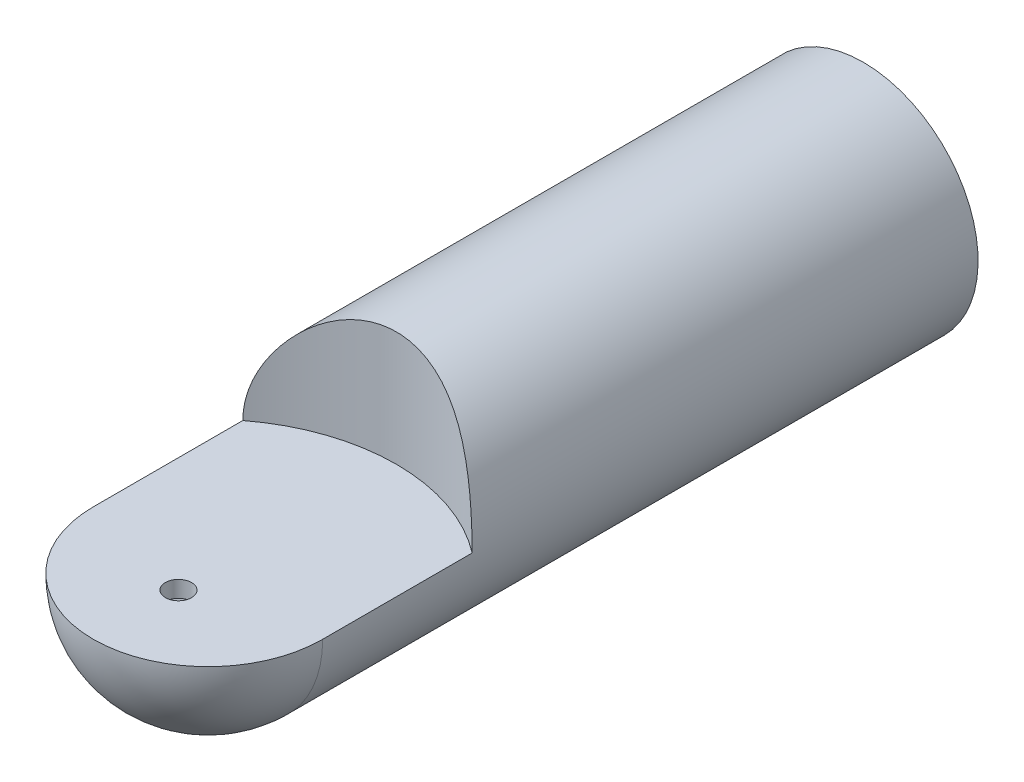
ISO-10303-21;
HEADER;
FILE_DESCRIPTION(('STEP AP214'),'2;1');
FILE_NAME('part.step','',(''),(''),'','','');
FILE_SCHEMA(('AUTOMOTIVE_DESIGN { 1 0 10303 214 1 1 1 1 }'));
ENDSEC;
DATA;
#1=APPLICATION_CONTEXT('core data for automotive mechanical design processes');
#2=APPLICATION_PROTOCOL_DEFINITION('international standard','automotive_design',2000,#1);
#3=PRODUCT_CONTEXT('',#1,'mechanical');
#4=PRODUCT('Part','Part','',(#3));
#5=PRODUCT_RELATED_PRODUCT_CATEGORY('part','',(#4));
#6=PRODUCT_DEFINITION_FORMATION('','',#4);
#7=PRODUCT_DEFINITION_CONTEXT('part definition',#1,'design');
#8=PRODUCT_DEFINITION('design','',#6,#7);
#9=PRODUCT_DEFINITION_SHAPE('','',#8);
#10=(LENGTH_UNIT() NAMED_UNIT(*) SI_UNIT(.MILLI.,.METRE.));
#11=(NAMED_UNIT(*) PLANE_ANGLE_UNIT() SI_UNIT($,.RADIAN.));
#12=(NAMED_UNIT(*) SI_UNIT($,.STERADIAN.) SOLID_ANGLE_UNIT());
#13=UNCERTAINTY_MEASURE_WITH_UNIT(LENGTH_MEASURE(1.E-05),#10,'distance_accuracy_value','');
#14=(GEOMETRIC_REPRESENTATION_CONTEXT(3) GLOBAL_UNCERTAINTY_ASSIGNED_CONTEXT((#13)) GLOBAL_UNIT_ASSIGNED_CONTEXT((#10,
#11,#12)) REPRESENTATION_CONTEXT('',''));
#15=CARTESIAN_POINT('',(0.,0.,0.));
#16=DIRECTION('',(0.,0.,1.));
#17=DIRECTION('',(1.,0.,0.));
#18=AXIS2_PLACEMENT_3D('',#15,#16,#17);
#19=CARTESIAN_POINT('',(0.,6.98296267768627E-13,-200.));
#20=DIRECTION('',(0.,0.,1.));
#21=DIRECTION('',(0.,-1.,0.));
#22=AXIS2_PLACEMENT_3D('',#19,#20,#21);
#23=CYLINDRICAL_SURFACE('',#22,30.);
#24=CARTESIAN_POINT('',(0.,6.98296267768627E-13,-200.));
#25=DIRECTION('',(0.,0.,-1.));
#26=DIRECTION('',(0.,1.,0.));
#27=AXIS2_PLACEMENT_3D('',#24,#25,#26);
#28=CIRCLE('',#27,30.);
#29=CARTESIAN_POINT('',(0.,30.0000000000007,-200.));
#30=VERTEX_POINT('',#29);
#31=EDGE_CURVE('E127',#30,#30,#28,.T.);
#32=ORIENTED_EDGE('',*,*,#31,.T.);
#33=EDGE_LOOP('',(#32));
#34=FACE_BOUND('',#33,.T.);
#35=DIRECTION('',(0.,0.,1.));
#36=VECTOR('',#35,1.);
#37=CARTESIAN_POINT('',(30.,0.,-60.));
#38=LINE('',#37,#36);
#39=CARTESIAN_POINT('',(30.,0.,-60.));
#40=VERTEX_POINT('',#39);
#41=CARTESIAN_POINT('',(30.,0.,-51.9615242270663));
#42=VERTEX_POINT('',#41);
#43=EDGE_CURVE('E115',#40,#42,#38,.T.);
#44=ORIENTED_EDGE('',*,*,#43,.T.);
#45=CARTESIAN_POINT('',(-30.,1.81422692176647E-13,-51.9615242270663));
#46=CARTESIAN_POINT('',(-30.0000091798726,0.392809760654041,-51.9615093263235));
#47=CARTESIAN_POINT('',(-29.9922851874291,0.785612678203957,-51.9659781302787));
#48=CARTESIAN_POINT('',(-29.961440464049,1.57039676987166,-51.9837730985279));
#49=CARTESIAN_POINT('',(-29.9383203732621,1.96237797747535,-51.9970988945596));
#50=CARTESIAN_POINT('',(-29.8767715969323,2.74450768419843,-52.0324871503205));
#51=CARTESIAN_POINT('',(-29.8383521437951,3.13465714528491,-52.0545443410389));
#52=CARTESIAN_POINT('',(-29.7463501290099,3.91255897612959,-52.1071724990167));
#53=CARTESIAN_POINT('',(-29.69276748444,4.30031133276705,-52.1377435128351));
#54=CARTESIAN_POINT('',(-29.510222440085,5.45442425006918,-52.2414267834424));
#55=CARTESIAN_POINT('',(-29.3590902808451,6.2163340881356,-52.3267274546173));
#56=CARTESIAN_POINT('',(-28.9993828663403,7.72241090624753,-52.526925852637));
#57=CARTESIAN_POINT('',(-28.7908010129577,8.46657583761071,-52.6418269790064));
#58=CARTESIAN_POINT('',(-28.3189990470382,9.93099846350205,-52.8971266720336));
#59=CARTESIAN_POINT('',(-28.0558998680208,10.6513050481136,-53.0374687193425));
#60=CARTESIAN_POINT('',(-27.4772646843731,12.0658170142195,-53.3395383584033));
#61=CARTESIAN_POINT('',(-27.1617293514576,12.76002272993,-53.5012656762014));
#62=CARTESIAN_POINT('',(-26.4802145075927,14.120116040062,-53.8418377777769));
#63=CARTESIAN_POINT('',(-26.1141626015585,14.7859611660341,-54.0207070130884));
#64=CARTESIAN_POINT('',(-25.3343739367879,16.0855157677059,-54.3907688004122));
#65=CARTESIAN_POINT('',(-24.9206347795692,16.7192236247164,-54.581961972057));
#66=CARTESIAN_POINT('',(-24.0120389363782,18.0024879905419,-54.9880839402806));
#67=CARTESIAN_POINT('',(-23.5133151137554,18.6490996411369,-55.2036749068246));
#68=CARTESIAN_POINT('',(-22.4655015730013,19.8989018127804,-55.6383226215725));
#69=CARTESIAN_POINT('',(-21.916409641113,20.5020904232371,-55.8573795217591));
#70=CARTESIAN_POINT('',(-20.7704149631897,21.662290340859,-56.2935678892847));
#71=CARTESIAN_POINT('',(-20.1735004962016,22.2192902590201,-56.510698870022));
#72=CARTESIAN_POINT('',(-18.9347368840772,23.2839598337948,-56.9377289243244));
#73=CARTESIAN_POINT('',(-18.2928864232626,23.7916280449881,-57.147627785872));
#74=CARTESIAN_POINT('',(-16.9223258347001,24.7870903985199,-57.5689403537398));
#75=CARTESIAN_POINT('',(-16.1906770936463,25.2712139357782,-57.779495091711));
#76=CARTESIAN_POINT('',(-14.6836489819937,26.1756128796046,-58.1807394258518));
#77=CARTESIAN_POINT('',(-13.9082670936699,26.5958846050576,-58.3714278765128));
#78=CARTESIAN_POINT('',(-12.3190710741689,27.3682398933905,-58.7273626077921));
#79=CARTESIAN_POINT('',(-11.5052755177489,27.7203560008774,-58.8926210235971));
#80=CARTESIAN_POINT('',(-9.84478503552948,28.3525868006262,-59.1928349582515));
#81=CARTESIAN_POINT('',(-8.99809361803839,28.6327091468132,-59.3277936981792));
#82=CARTESIAN_POINT('',(-7.33985505004734,29.1000844851375,-59.5548174094954));
#83=CARTESIAN_POINT('',(-6.53009343195671,29.2925269515887,-59.6492510184358));
#84=CARTESIAN_POINT('',(-4.89432640102882,29.6097873619636,-59.8056887350046));
#85=CARTESIAN_POINT('',(-4.06832169560414,29.7346082441864,-59.8676942516973));
#86=CARTESIAN_POINT('',(-2.40733657148733,29.9149169026983,-59.9574527357695));
#87=CARTESIAN_POINT('',(-1.5723607858635,29.970438881347,-59.9852226000158));
#88=CARTESIAN_POINT('',(0.0997187683066177,30.0114861086271,-60.0057409160246));
#89=CARTESIAN_POINT('',(0.936822403551029,29.9970156390292,-59.9984915100824));
#90=CARTESIAN_POINT('',(2.53310337771609,29.9026077267696,-59.9513515157758));
#91=CARTESIAN_POINT('',(3.2927186774459,29.8284810427445,-59.9143583761271));
#92=CARTESIAN_POINT('',(4.80219564850333,29.6229475529163,-59.8122984805113));
#93=CARTESIAN_POINT('',(5.55205800274208,29.4915447801227,-59.7472337011697));
#94=CARTESIAN_POINT('',(7.03697520684407,29.1728928538575,-59.5905903237625));
#95=CARTESIAN_POINT('',(7.77202985660625,28.9856429462462,-59.4990113676594));
#96=CARTESIAN_POINT('',(9.22270786194143,28.557201003996,-59.2914717944373));
#97=CARTESIAN_POINT('',(9.93833051974477,28.3160070351828,-59.1755103030869));
#98=CARTESIAN_POINT('',(11.3556880867226,27.778242935097,-58.9200648452848));
#99=CARTESIAN_POINT('',(12.0570963219388,27.4809563726333,-58.7802791144361));
#100=CARTESIAN_POINT('',(13.4319303548073,26.8357953626498,-58.4814346674831));
#101=CARTESIAN_POINT('',(14.1053561794792,26.4879209639788,-58.3223759699893));
#102=CARTESIAN_POINT('',(15.4212013768469,25.7440845394983,-57.9883389229998));
#103=CARTESIAN_POINT('',(16.0636121731183,25.3481093178501,-57.8133562082736));
#104=CARTESIAN_POINT('',(17.314449145332,24.5107416781157,-57.4511440623537));
#105=CARTESIAN_POINT('',(17.9228734715854,24.0693467918056,-57.2639139658069));
#106=CARTESIAN_POINT('',(19.159154312019,23.0997978631767,-56.8628866553975));
#107=CARTESIAN_POINT('',(19.7834157381774,22.5673869156107,-56.6482506804608));
#108=CARTESIAN_POINT('',(20.6847334249277,21.7326848689268,-56.3226775398882));
#109=CARTESIAN_POINT('',(20.9793465062815,21.448415202506,-56.2135421172428));
#110=CARTESIAN_POINT('',(21.5566666798484,20.8681014574253,-55.9946910130667));
#111=CARTESIAN_POINT('',(21.8393710101746,20.5720546780261,-55.8849752035011));
#112=CARTESIAN_POINT('',(22.6693827857693,19.6664681355554,-55.5558585245773));
#113=CARTESIAN_POINT('',(23.1982502905715,19.039795932454,-55.3366119945165));
#114=CARTESIAN_POINT('',(24.2038357107074,17.7439265916168,-54.9042254603086));
#115=CARTESIAN_POINT('',(24.6805540226717,17.0747297773715,-54.6910854097266));
#116=CARTESIAN_POINT('',(25.3687845167562,16.0192510677325,-54.3736529457869));
#117=CARTESIAN_POINT('',(25.6000614006936,15.6470194077533,-54.2650720787736));
#118=CARTESIAN_POINT('',(26.0465285101413,14.8919679784222,-54.0521922450326));
#119=CARTESIAN_POINT('',(26.2617223185046,14.5091505934591,-53.9478923269789));
#120=CARTESIAN_POINT('',(26.8826474204278,13.3452744903072,-53.6426706567808));
#121=CARTESIAN_POINT('',(27.2637193525292,12.5487964778061,-53.4494284070767));
#122=CARTESIAN_POINT('',(27.9552155580417,10.9218070433223,-53.0910297637089));
#123=CARTESIAN_POINT('',(28.2657869268702,10.0913708291303,-52.9258150776784));
#124=CARTESIAN_POINT('',(28.8134500568311,8.40080876319936,-52.6296713041899));
#125=CARTESIAN_POINT('',(29.0505736564392,7.54069595601538,-52.4987273647188));
#126=CARTESIAN_POINT('',(29.3731430534851,6.12612467786132,-52.3186232181902));
#127=CARTESIAN_POINT('',(29.4820873551508,5.57845147740076,-52.2572301454009));
#128=CARTESIAN_POINT('',(29.6694120393373,4.47640403965738,-52.1511034272162));
#129=CARTESIAN_POINT('',(29.7478008878682,3.92203170245884,-52.1063651674206));
#130=CARTESIAN_POINT('',(29.8735953362339,2.80768692155723,-52.0343526778058));
#131=CARTESIAN_POINT('',(29.9209473822713,2.24770648209844,-52.0071086357803));
#132=CARTESIAN_POINT('',(29.9841756942571,1.12516021358658,-51.9706593181305));
#133=CARTESIAN_POINT('',(30.0000390911404,0.562593421623771,-51.9614614177839));
#134=CARTESIAN_POINT('',(30.,1.78766613958742E-13,-51.9615242270663));
#135=B_SPLINE_CURVE_WITH_KNOTS('',3,(#45,#46,#47,#48,#49,#50,#51,#52,#53,#54,#55,#56,#57,#58,
#59,#60,#61,#62,#63,#64,#65,#66,#67,#68,#69,#70,#71,#72,#73,#74,#75,#76,#77,#78,#79,#80,#81,#82,
#83,#84,#85,#86,#87,#88,#89,#90,#91,#92,#93,#94,#95,#96,#97,#98,#99,#100,#101,#102,#103,#104,
#105,#106,#107,#108,#109,#110,#111,#112,#113,#114,#115,#116,#117,#118,#119,#120,#121,#122,#123,
#124,#125,#126,#127,#128,#129,#130,#131,#132,#133,#134),.UNSPECIFIED.,.F.,.F.,(4,2,2,2,2,2,2,2,
2,2,2,2,2,2,2,2,2,2,2,2,2,2,2,2,2,2,2,2,2,2,2,2,2,2,2,2,2,2,2,2,2,2,2,2,4),(0.,1.17831572874021,
2.35658246770658,3.53413925605337,4.71170248416026,7.05273917038327,9.39404483769565,
11.7302114407247,14.0663481194249,16.4058681607371,18.7455059221455,21.2765523321911,
23.807710039025,26.3394900231363,28.8713441661112,31.5745573990549,34.27792641562,
36.9800013597355,39.6817889172559,42.1913499257393,44.7008018798057,47.209014807613,
49.7170742980536,52.0067258400078,54.2962161856332,56.585737449117,58.8753408169734,
61.1964548717646,63.517566685249,65.8393167099478,68.1611929713416,70.7024391151354,
71.9732419426945,73.2443378911899,75.7879596068649,78.3315619751911,79.6856162064097,
81.0393678880376,83.7468883996948,86.4487068107121,89.1493523807025,90.8336693824939,
92.5175193776956,94.2042672491591,95.8917043341319),.UNSPECIFIED.);
#136=CARTESIAN_POINT('',(-30.,0.,-51.9615242270663));
#137=VERTEX_POINT('',#136);
#138=EDGE_CURVE('E59',#137,#42,#135,.T.);
#139=ORIENTED_EDGE('',*,*,#138,.F.);
#140=DIRECTION('',(0.,0.,1.));
#141=VECTOR('',#140,1.);
#142=CARTESIAN_POINT('',(-30.,0.,-60.));
#143=LINE('',#142,#141);
#144=CARTESIAN_POINT('',(-30.,0.,-60.));
#145=VERTEX_POINT('',#144);
#146=EDGE_CURVE('E107',#145,#137,#143,.T.);
#147=ORIENTED_EDGE('',*,*,#146,.F.);
#148=CARTESIAN_POINT('',(0.,2.09488880330588E-13,-60.));
#149=DIRECTION('',(0.,0.,-1.));
#150=DIRECTION('',(0.,1.,0.));
#151=AXIS2_PLACEMENT_3D('',#148,#149,#150);
#152=CIRCLE('',#151,30.);
#153=CARTESIAN_POINT('',(-29.5803989154981,-4.99999999999979,-60.));
#154=VERTEX_POINT('',#153);
#155=EDGE_CURVE('E50',#154,#145,#152,.T.);
#156=ORIENTED_EDGE('',*,*,#155,.F.);
#157=DIRECTION('',(0.,0.,1.));
#158=VECTOR('',#157,1.);
#159=CARTESIAN_POINT('',(-29.5803989154981,-4.9999999999993,-200.));
#160=LINE('',#159,#158);
#161=CARTESIAN_POINT('',(-29.5803989154981,-5.,0.));
#162=VERTEX_POINT('',#161);
#163=EDGE_CURVE('E69',#154,#162,#160,.T.);
#164=ORIENTED_EDGE('',*,*,#163,.T.);
#165=CARTESIAN_POINT('',(0.,0.,0.));
#166=DIRECTION('',(0.,0.,1.));
#167=DIRECTION('',(0.,-1.,0.));
#168=AXIS2_PLACEMENT_3D('',#165,#166,#167);
#169=CIRCLE('',#168,30.);
#170=CARTESIAN_POINT('',(29.5803989154981,-5.,0.));
#171=VERTEX_POINT('',#170);
#172=EDGE_CURVE('E139',#162,#171,#169,.T.);
#173=ORIENTED_EDGE('',*,*,#172,.T.);
#174=DIRECTION('',(0.,0.,1.));
#175=VECTOR('',#174,1.);
#176=CARTESIAN_POINT('',(29.5803989154981,-4.9999999999993,-200.));
#177=LINE('',#176,#175);
#178=CARTESIAN_POINT('',(29.5803989154981,-4.99999999999979,-60.));
#179=VERTEX_POINT('',#178);
#180=EDGE_CURVE('E117',#171,#179,#177,.F.);
#181=ORIENTED_EDGE('',*,*,#180,.T.);
#182=EDGE_CURVE('E11',#40,#179,#152,.T.);
#183=ORIENTED_EDGE('',*,*,#182,.F.);
#184=EDGE_LOOP('',(#44,#139,#147,#156,#164,#173,#181,#183));
#185=FACE_BOUND('',#184,.T.);
#186=ADVANCED_FACE('F43',(#34,#185),#23,.F.);
#187=CARTESIAN_POINT('',(0.,0.,0.));
#188=DIRECTION('',(0.,1.,0.));
#189=DIRECTION('',(0.,0.,1.));
#190=AXIS2_PLACEMENT_3D('',#187,#188,#189);
#191=PLANE('',#190);
#192=ORIENTED_EDGE('',*,*,#146,.T.);
#193=CARTESIAN_POINT('',(0.,0.,0.));
#194=DIRECTION('',(0.,1.,0.));
#195=DIRECTION('',(0.,0.,1.));
#196=AXIS2_PLACEMENT_3D('',#193,#194,#195);
#197=CIRCLE('',#196,60.);
#198=CARTESIAN_POINT('',(0.,0.,-60.));
#199=VERTEX_POINT('',#198);
#200=EDGE_CURVE('E97',#199,#137,#197,.T.);
#201=ORIENTED_EDGE('',*,*,#200,.F.);
#202=DIRECTION('',(1.,0.,0.));
#203=VECTOR('',#202,1.);
#204=CARTESIAN_POINT('',(30.,0.,-60.));
#205=LINE('',#204,#203);
#206=EDGE_CURVE('E120',#145,#199,#205,.T.);
#207=ORIENTED_EDGE('',*,*,#206,.F.);
#208=EDGE_LOOP('',(#192,#201,#207));
#209=FACE_BOUND('',#208,.T.);
#210=ADVANCED_FACE('F114',(#209),#191,.T.);
#211=EDGE_CURVE('E233',#199,#40,#205,.T.);
#212=ORIENTED_EDGE('',*,*,#211,.F.);
#213=EDGE_CURVE('E100',#42,#199,#197,.T.);
#214=ORIENTED_EDGE('',*,*,#213,.F.);
#215=ORIENTED_EDGE('',*,*,#43,.F.);
#216=EDGE_LOOP('',(#212,#214,#215));
#217=FACE_BOUND('',#216,.T.);
#218=ADVANCED_FACE('F176',(#217),#191,.T.);
#219=CARTESIAN_POINT('',(0.,6.98296267768627E-13,-200.));
#220=DIRECTION('',(0.,0.,1.));
#221=DIRECTION('',(0.,-1.,0.));
#222=AXIS2_PLACEMENT_3D('',#219,#220,#221);
#223=CYLINDRICAL_SURFACE('',#222,35.);
#224=CARTESIAN_POINT('',(0.,6.98296267768627E-13,-200.));
#225=DIRECTION('',(0.,0.,-1.));
#226=DIRECTION('',(0.,1.,0.));
#227=AXIS2_PLACEMENT_3D('',#224,#225,#226);
#228=CIRCLE('',#227,35.);
#229=CARTESIAN_POINT('',(0.,35.0000000000007,-200.));
#230=VERTEX_POINT('',#229);
#231=EDGE_CURVE('E126',#230,#230,#228,.T.);
#232=ORIENTED_EDGE('',*,*,#231,.F.);
#233=EDGE_LOOP('',(#232));
#234=FACE_BOUND('',#233,.T.);
#235=DIRECTION('',(0.,0.,-1.));
#236=VECTOR('',#235,1.);
#237=CARTESIAN_POINT('',(-35.,0.,0.));
#238=LINE('',#237,#236);
#239=CARTESIAN_POINT('',(-35.,0.,0.));
#240=VERTEX_POINT('',#239);
#241=CARTESIAN_POINT('',(-35.,0.,-45.6207189772366));
#242=VERTEX_POINT('',#241);
#243=EDGE_CURVE('E191',#240,#242,#238,.T.);
#244=ORIENTED_EDGE('',*,*,#243,.T.);
#245=CARTESIAN_POINT('',(35.,1.59283888973629E-13,-45.6207189772366));
#246=CARTESIAN_POINT('',(35.0000132814846,0.441016017965573,-45.6206936340977));
#247=CARTESIAN_POINT('',(34.9916647919843,0.882021446764125,-45.6271133292722));
#248=CARTESIAN_POINT('',(34.9583447843239,1.76300413175627,-45.6526552963177));
#249=CARTESIAN_POINT('',(34.9333744835933,2.20298146088264,-45.6717766378834));
#250=CARTESIAN_POINT('',(34.866944416921,3.08052887810543,-45.7225091876469));
#251=CARTESIAN_POINT('',(34.8255010886678,3.51810092636903,-45.7541079449904));
#252=CARTESIAN_POINT('',(34.7263280924881,4.39031595424183,-45.8294225480693));
#253=CARTESIAN_POINT('',(34.6685982300864,4.82495889881154,-45.8731385384947));
#254=CARTESIAN_POINT('',(34.4724127336728,6.11602996314459,-46.0209724012366));
#255=CARTESIAN_POINT('',(34.3103872772125,6.96708379793807,-46.1422231362879));
#256=CARTESIAN_POINT('',(33.9256692067137,8.64831231569428,-46.4258091177432));
#257=CARTESIAN_POINT('',(33.7029638091541,9.47848255878341,-46.5881530207854));
#258=CARTESIAN_POINT('',(33.2007979980055,11.1100255799001,-46.9473303976439));
#259=CARTESIAN_POINT('',(32.9215630197599,11.9114983094678,-47.1440264628765));
#260=CARTESIAN_POINT('',(32.3087563273008,13.4854589468316,-47.5660861861284));
#261=CARTESIAN_POINT('',(31.9751863803307,14.2579477963226,-47.7914489117132));
#262=CARTESIAN_POINT('',(31.2556860108866,15.7729825993509,-48.26508016035));
#263=CARTESIAN_POINT('',(30.8696427531386,16.5154594264205,-48.5133976653245));
#264=CARTESIAN_POINT('',(30.0481406672281,17.9667629954317,-49.0264591273308));
#265=CARTESIAN_POINT('',(29.6126761218755,18.675585830707,-49.2912049832304));
#266=CARTESIAN_POINT('',(28.8953359052901,19.7554435956038,-49.71317185343));
#267=CARTESIAN_POINT('',(28.6295402988808,20.1386812719649,-49.8668021422883));
#268=CARTESIAN_POINT('',(28.0833998636072,20.8935306856562,-50.1764006159407));
#269=CARTESIAN_POINT('',(27.8030580849819,21.2651448343791,-50.3323683057576));
#270=CARTESIAN_POINT('',(26.9405302253458,22.3623229223068,-50.8024254036508));
#271=CARTESIAN_POINT('',(26.3368315562118,23.0702376395365,-51.1186748208723));
#272=CARTESIAN_POINT('',(25.0744880639146,24.4363536407795,-51.7495720536684));
#273=CARTESIAN_POINT('',(24.4158257186558,25.0945389429509,-52.0642193243087));
#274=CARTESIAN_POINT('',(23.045885785789,26.3582155126085,-52.6849379089432));
#275=CARTESIAN_POINT('',(22.3346054311267,26.963704005247,-52.9910087707561));
#276=CARTESIAN_POINT('',(20.7787808356351,28.1837984124997,-53.6215791087673));
#277=CARTESIAN_POINT('',(19.9282521335271,28.7917404314311,-53.9442676201934));
#278=CARTESIAN_POINT('',(18.1688933319955,29.9331053100772,-54.5619879938027));
#279=CARTESIAN_POINT('',(17.2600577162505,30.4665211037724,-54.8570172326692));
#280=CARTESIAN_POINT('',(15.3897841935553,31.4526828959021,-55.4107832527335));
#281=CARTESIAN_POINT('',(14.428381299362,31.9054817544519,-55.669543791274));
#282=CARTESIAN_POINT('',(12.4590681886559,32.7247361022959,-56.1430899324929));
#283=CARTESIAN_POINT('',(11.4511659311932,33.0912063029221,-56.3578830268781));
#284=CARTESIAN_POINT('',(9.4974817984731,33.7007479278822,-56.7180405241708));
#285=CARTESIAN_POINT('',(8.55523765081944,33.9523720276384,-56.8681350267426));
#286=CARTESIAN_POINT('',(6.64707865589367,34.3769011936379,-57.122608364808));
#287=CARTESIAN_POINT('',(5.68116521419584,34.5498109223646,-57.2269899080006));
#288=CARTESIAN_POINT('',(3.73501516988287,34.8139804068221,-57.3868641741261));
#289=CARTESIAN_POINT('',(2.7547908583927,34.9053064704244,-57.4423965990646));
#290=CARTESIAN_POINT('',(0.788614451661071,35.0049522822935,-57.5030003461268));
#291=CARTESIAN_POINT('',(-0.197337024072321,35.0132808470662,-57.5080770279703));
#292=CARTESIAN_POINT('',(-2.0395789943252,34.9510807319127,-57.4702332065138));
#293=CARTESIAN_POINT('',(-2.89635168324428,34.8904846196985,-57.4333581306057));
#294=CARTESIAN_POINT('',(-4.60063638724798,34.7068944250947,-57.3220128544264));
#295=CARTESIAN_POINT('',(-5.44814937623926,34.5839069706453,-57.24754664753));
#296=CARTESIAN_POINT('',(-7.12809602364315,34.2770983352651,-57.062724333655));
#297=CARTESIAN_POINT('',(-7.96052915530841,34.0932750336112,-56.9523669755218));
#298=CARTESIAN_POINT('',(-9.60500648186516,33.6669784914873,-56.6982025689736));
#299=CARTESIAN_POINT('',(-10.4170498282986,33.4245028148291,-56.5543941311424));
#300=CARTESIAN_POINT('',(-12.0197919872125,32.882270182947,-56.2356237981317));
#301=CARTESIAN_POINT('',(-12.8103740253839,32.5822521816088,-56.0605201862074));
#302=CARTESIAN_POINT('',(-14.3622632121242,31.9285824553564,-55.6831498159794));
#303=CARTESIAN_POINT('',(-15.1235706620071,31.5749312826567,-55.4808833373507));
#304=CARTESIAN_POINT('',(-16.6137262375867,30.8169270445394,-55.0530208980489));
#305=CARTESIAN_POINT('',(-17.3425714484937,30.4125694385705,-54.8274228484477));
#306=CARTESIAN_POINT('',(-18.7651021471887,29.5560549205275,-54.3569895350225));
#307=CARTESIAN_POINT('',(-19.4587854177235,29.1038949996531,-54.1121530605319));
#308=CARTESIAN_POINT('',(-20.8906038993477,28.0969508910228,-53.5769103422869));
#309=CARTESIAN_POINT('',(-21.623946524254,27.536370075773,-53.284576478484));
#310=CARTESIAN_POINT('',(-23.041152628684,26.3619500991852,-52.6872542959178));
#311=CARTESIAN_POINT('',(-23.725012663748,25.7481072368292,-52.3822650985433));
#312=CARTESIAN_POINT('',(-25.0420573812055,24.4691495713648,-51.7655763599103));
#313=CARTESIAN_POINT('',(-25.675159524482,23.8039545771049,-51.453866894574));
#314=CARTESIAN_POINT('',(-26.8873114700552,22.4257614393082,-50.8309640578512));
#315=CARTESIAN_POINT('',(-27.4663585906595,21.7127609271314,-50.5197707128211));
#316=CARTESIAN_POINT('',(-28.6353077614154,20.1514910628975,-49.8675238967361));
#317=CARTESIAN_POINT('',(-29.2179210081707,19.297329600938,-49.5274573733706));
#318=CARTESIAN_POINT('',(-30.3084689084648,17.5348425247009,-48.8677097009765));
#319=CARTESIAN_POINT('',(-30.8163914637436,16.6265081690165,-48.5480318592074));
#320=CARTESIAN_POINT('',(-31.7513879228928,14.7625503489126,-47.9417239977363));
#321=CARTESIAN_POINT('',(-32.1787231778982,13.8070928866001,-47.6549883688326));
#322=CARTESIAN_POINT('',(-32.9492639381029,11.8511474057963,-47.1255227816072));
#323=CARTESIAN_POINT('',(-33.2924986067358,10.8506751398715,-46.8827775764176));
#324=CARTESIAN_POINT('',(-33.8203049594494,9.0473531106274,-46.5028684296739));
#325=CARTESIAN_POINT('',(-34.023212444939,8.25223104669917,-46.3542681521152));
#326=CARTESIAN_POINT('',(-34.3734884400708,6.64378548642291,-46.0951304821315));
#327=CARTESIAN_POINT('',(-34.5208760608657,5.83046835552966,-45.9845799932692));
#328=CARTESIAN_POINT('',(-34.6991799941177,4.59796140090872,-45.8499978262223));
#329=CARTESIAN_POINT('',(-34.7516014047319,4.18344222948181,-45.8102538660641));
#330=CARTESIAN_POINT('',(-34.8416393102244,3.35186445255087,-45.7418124503328));
#331=CARTESIAN_POINT('',(-34.8792559933204,2.93480587939961,-45.7131148543234));
#332=CARTESIAN_POINT('',(-34.9395461499552,2.0985694689288,-45.6670518527829));
#333=CARTESIAN_POINT('',(-34.9622046257737,1.67938992795854,-45.6496978209517));
#334=CARTESIAN_POINT('',(-34.9924374838216,0.840143232048944,-45.6265205897732));
#335=CARTESIAN_POINT('',(-35.0000109086939,0.420076022468118,-45.6206981222645));
#336=CARTESIAN_POINT('',(-35.,1.37312386020026E-13,-45.6207189772366));
#337=B_SPLINE_CURVE_WITH_KNOTS('',3,(#245,#246,#247,#248,#249,#250,#251,#252,#253,#254,#255,
#256,#257,#258,#259,#260,#261,#262,#263,#264,#265,#266,#267,#268,#269,#270,#271,#272,#273,#274,
#275,#276,#277,#278,#279,#280,#281,#282,#283,#284,#285,#286,#287,#288,#289,#290,#291,#292,#293,
#294,#295,#296,#297,#298,#299,#300,#301,#302,#303,#304,#305,#306,#307,#308,#309,#310,#311,#312,
#313,#314,#315,#316,#317,#318,#319,#320,#321,#322,#323,#324,#325,#326,#327,#328,#329,#330,#331,
#332,#333,#334,#335,#336),.UNSPECIFIED.,.F.,.F.,(4,2,2,2,2,2,2,2,2,2,2,2,2,2,2,2,2,2,2,2,2,2,2,
2,2,2,2,2,2,2,2,2,2,2,2,2,2,2,2,2,2,2,2,2,2,4),(0.,1.32290395042524,2.64571101820999,
3.96720141714135,5.28870759648408,7.90924951242997,10.5303439287377,13.1411845567359,
15.7519402841624,18.3684015475106,20.9851657993925,22.4579641738505,23.9304549503118,
26.8753792464394,29.8212459801485,32.7672677401669,36.0453279926054,39.3236988355996,
42.5999120866834,45.8755666312454,48.831526005823,51.7873102674592,54.7406899968898,
57.6937559967766,60.2697803608123,62.8455311266169,65.421371691937,67.9973192658826,
70.5852417706173,73.1731376315552,75.7612653935573,78.3495561560571,81.2513455944497,
84.1533368311037,87.0599552159643,89.9667177228426,93.2279841659401,96.4897782824408,
99.7408050327975,102.990702828935,105.489968857812,107.988373796759,109.247153689409,
110.505917578229,111.765941646903,113.026045679142),.UNSPECIFIED.);
#338=CARTESIAN_POINT('',(35.,0.,-45.6207189772366));
#339=VERTEX_POINT('',#338);
#340=EDGE_CURVE('E184',#339,#242,#337,.T.);
#341=ORIENTED_EDGE('',*,*,#340,.F.);
#342=DIRECTION('',(0.,0.,-1.));
#343=VECTOR('',#342,1.);
#344=CARTESIAN_POINT('',(35.,0.,0.));
#345=LINE('',#344,#343);
#346=CARTESIAN_POINT('',(35.,0.,0.));
#347=VERTEX_POINT('',#346);
#348=EDGE_CURVE('E113',#347,#339,#345,.T.);
#349=ORIENTED_EDGE('',*,*,#348,.F.);
#350=CARTESIAN_POINT('',(0.,0.,0.));
#351=DIRECTION('',(0.,0.,1.));
#352=DIRECTION('',(0.,-1.,0.));
#353=AXIS2_PLACEMENT_3D('',#350,#351,#352);
#354=CIRCLE('',#353,35.);
#355=EDGE_CURVE('E143',#240,#347,#354,.T.);
#356=ORIENTED_EDGE('',*,*,#355,.F.);
#357=EDGE_LOOP('',(#244,#341,#349,#356));
#358=FACE_BOUND('',#357,.T.);
#359=ADVANCED_FACE('F179',(#234,#358),#223,.T.);
#360=CARTESIAN_POINT('',(0.,0.,0.));
#361=DIRECTION('',(0.,1.,0.));
#362=DIRECTION('',(0.,0.,1.));
#363=AXIS2_PLACEMENT_3D('',#360,#361,#362);
#364=CIRCLE('',#363,57.5);
#365=EDGE_CURVE('E208',#339,#242,#364,.T.);
#366=ORIENTED_EDGE('',*,*,#365,.T.);
#367=ORIENTED_EDGE('',*,*,#243,.F.);
#368=CARTESIAN_POINT('',(0.,0.,0.));
#369=DIRECTION('',(0.,1.,0.));
#370=DIRECTION('',(0.,0.,1.));
#371=AXIS2_PLACEMENT_3D('',#368,#369,#370);
#372=CIRCLE('',#371,35.);
#373=EDGE_CURVE('E145',#240,#347,#372,.T.);
#374=ORIENTED_EDGE('',*,*,#373,.T.);
#375=ORIENTED_EDGE('',*,*,#348,.T.);
#376=EDGE_LOOP('',(#366,#367,#374,#375));
#377=FACE_BOUND('',#376,.T.);
#378=CARTESIAN_POINT('',(0.,0.,9.));
#379=DIRECTION('',(0.,1.,0.));
#380=DIRECTION('',(0.,0.,1.));
#381=AXIS2_PLACEMENT_3D('',#378,#379,#380);
#382=CIRCLE('',#381,4.);
#383=CARTESIAN_POINT('',(0.,0.,13.));
#384=VERTEX_POINT('',#383);
#385=EDGE_CURVE('E131',#384,#384,#382,.T.);
#386=ORIENTED_EDGE('',*,*,#385,.F.);
#387=EDGE_LOOP('',(#386));
#388=FACE_BOUND('',#387,.T.);
#389=ADVANCED_FACE('F180',(#377,#388),#191,.T.);
#390=CARTESIAN_POINT('',(0.,0.,0.));
#391=DIRECTION('',(-1.,0.,0.));
#392=DIRECTION('',(0.,1.,0.));
#393=AXIS2_PLACEMENT_3D('',#390,#391,#392);
#394=SPHERICAL_SURFACE('',#393,35.);
#395=ORIENTED_EDGE('',*,*,#355,.T.);
#396=ORIENTED_EDGE('',*,*,#373,.F.);
#397=EDGE_LOOP('',(#395,#396));
#398=FACE_BOUND('',#397,.T.);
#399=ADVANCED_FACE('F44',(#398),#394,.T.);
#400=CARTESIAN_POINT('',(0.,-5.,0.));
#401=DIRECTION('',(0.,1.,0.));
#402=DIRECTION('',(0.,0.,1.));
#403=AXIS2_PLACEMENT_3D('',#400,#401,#402);
#404=PLANE('',#403);
#405=CARTESIAN_POINT('',(0.,-5.,9.));
#406=DIRECTION('',(0.,1.,0.));
#407=DIRECTION('',(0.,0.,1.));
#408=AXIS2_PLACEMENT_3D('',#405,#406,#407);
#409=CIRCLE('',#408,4.);
#410=CARTESIAN_POINT('',(0.,-5.,13.));
#411=VERTEX_POINT('',#410);
#412=EDGE_CURVE('E132',#411,#411,#409,.T.);
#413=ORIENTED_EDGE('',*,*,#412,.T.);
#414=EDGE_LOOP('',(#413));
#415=FACE_BOUND('',#414,.T.);
#416=CARTESIAN_POINT('',(0.,-5.,0.));
#417=DIRECTION('',(0.,1.,0.));
#418=DIRECTION('',(0.,0.,1.));
#419=AXIS2_PLACEMENT_3D('',#416,#417,#418);
#420=CIRCLE('',#419,29.5803989154981);
#421=EDGE_CURVE('E137',#162,#171,#420,.T.);
#422=ORIENTED_EDGE('',*,*,#421,.F.);
#423=ORIENTED_EDGE('',*,*,#163,.F.);
#424=DIRECTION('',(-1.,0.,0.));
#425=VECTOR('',#424,1.);
#426=CARTESIAN_POINT('',(30.,-4.99999999999979,-60.));
#427=LINE('',#426,#425);
#428=EDGE_CURVE('E194',#179,#154,#427,.T.);
#429=ORIENTED_EDGE('',*,*,#428,.F.);
#430=ORIENTED_EDGE('',*,*,#180,.F.);
#431=EDGE_LOOP('',(#422,#423,#429,#430));
#432=FACE_BOUND('',#431,.T.);
#433=ADVANCED_FACE('F148',(#415,#432),#404,.F.);
#434=CARTESIAN_POINT('',(0.,0.,0.));
#435=DIRECTION('',(-1.,0.,0.));
#436=DIRECTION('',(0.,1.,0.));
#437=AXIS2_PLACEMENT_3D('',#434,#435,#436);
#438=SPHERICAL_SURFACE('',#437,30.);
#439=ORIENTED_EDGE('',*,*,#172,.F.);
#440=ORIENTED_EDGE('',*,*,#421,.T.);
#441=EDGE_LOOP('',(#439,#440));
#442=FACE_BOUND('',#441,.T.);
#443=ADVANCED_FACE('F152',(#442),#438,.F.);
#444=CARTESIAN_POINT('',(0.,-7.,9.));
#445=DIRECTION('',(0.,1.,0.));
#446=DIRECTION('',(0.,0.,1.));
#447=AXIS2_PLACEMENT_3D('',#444,#445,#446);
#448=CYLINDRICAL_SURFACE('',#447,4.);
#449=ORIENTED_EDGE('',*,*,#385,.T.);
#450=EDGE_LOOP('',(#449));
#451=FACE_BOUND('',#450,.T.);
#452=ORIENTED_EDGE('',*,*,#412,.F.);
#453=EDGE_LOOP('',(#452));
#454=FACE_BOUND('',#453,.T.);
#455=ADVANCED_FACE('F151',(#451,#454),#448,.F.);
#456=CARTESIAN_POINT('',(0.,6.98296267768627E-13,-200.));
#457=DIRECTION('',(0.,0.,-1.));
#458=DIRECTION('',(0.,1.,0.));
#459=AXIS2_PLACEMENT_3D('',#456,#457,#458);
#460=PLANE('',#459);
#461=ORIENTED_EDGE('',*,*,#231,.T.);
#462=EDGE_LOOP('',(#461));
#463=FACE_BOUND('',#462,.T.);
#464=ORIENTED_EDGE('',*,*,#31,.F.);
#465=EDGE_LOOP('',(#464));
#466=FACE_BOUND('',#465,.T.);
#467=ADVANCED_FACE('F153',(#463,#466),#460,.T.);
#468=CARTESIAN_POINT('',(0.,2.09488880330588E-13,-60.));
#469=DIRECTION('',(0.,0.,-1.));
#470=DIRECTION('',(0.,1.,0.));
#471=AXIS2_PLACEMENT_3D('',#468,#469,#470);
#472=PLANE('',#471);
#473=ORIENTED_EDGE('',*,*,#206,.T.);
#474=ORIENTED_EDGE('',*,*,#211,.T.);
#475=ORIENTED_EDGE('',*,*,#182,.T.);
#476=ORIENTED_EDGE('',*,*,#428,.T.);
#477=ORIENTED_EDGE('',*,*,#155,.T.);
#478=EDGE_LOOP('',(#473,#474,#475,#476,#477));
#479=FACE_BOUND('',#478,.T.);
#480=ADVANCED_FACE('F163',(#479),#472,.T.);
#481=CARTESIAN_POINT('',(0.,113.,0.));
#482=DIRECTION('',(0.,-1.,0.));
#483=DIRECTION('',(0.,0.,-1.));
#484=AXIS2_PLACEMENT_3D('',#481,#482,#483);
#485=CYLINDRICAL_SURFACE('',#484,57.5);
#486=ORIENTED_EDGE('',*,*,#365,.F.);
#487=ORIENTED_EDGE('',*,*,#340,.T.);
#488=EDGE_LOOP('',(#486,#487));
#489=FACE_BOUND('',#488,.T.);
#490=ADVANCED_FACE('F199',(#489),#485,.F.);
#491=CARTESIAN_POINT('',(0.,69.462219947249,0.));
#492=DIRECTION('',(0.,-1.,0.));
#493=DIRECTION('',(0.,0.,-1.));
#494=AXIS2_PLACEMENT_3D('',#491,#492,#493);
#495=CYLINDRICAL_SURFACE('',#494,60.);
#496=ORIENTED_EDGE('',*,*,#213,.T.);
#497=ORIENTED_EDGE('',*,*,#200,.T.);
#498=ORIENTED_EDGE('',*,*,#138,.T.);
#499=EDGE_LOOP('',(#496,#497,#498));
#500=FACE_BOUND('',#499,.T.);
#501=ADVANCED_FACE('F96',(#500),#495,.T.);
#502=CLOSED_SHELL('',(#186,#210,#218,#359,#389,#399,#433,#443,#455,#467,#480,#490,#501));
#503=MANIFOLD_SOLID_BREP('B2',#502);
#504=ADVANCED_BREP_SHAPE_REPRESENTATION('',(#18,#503),#14);
#505=SHAPE_DEFINITION_REPRESENTATION(#9,#504);
ENDSEC;
END-ISO-10303-21;
